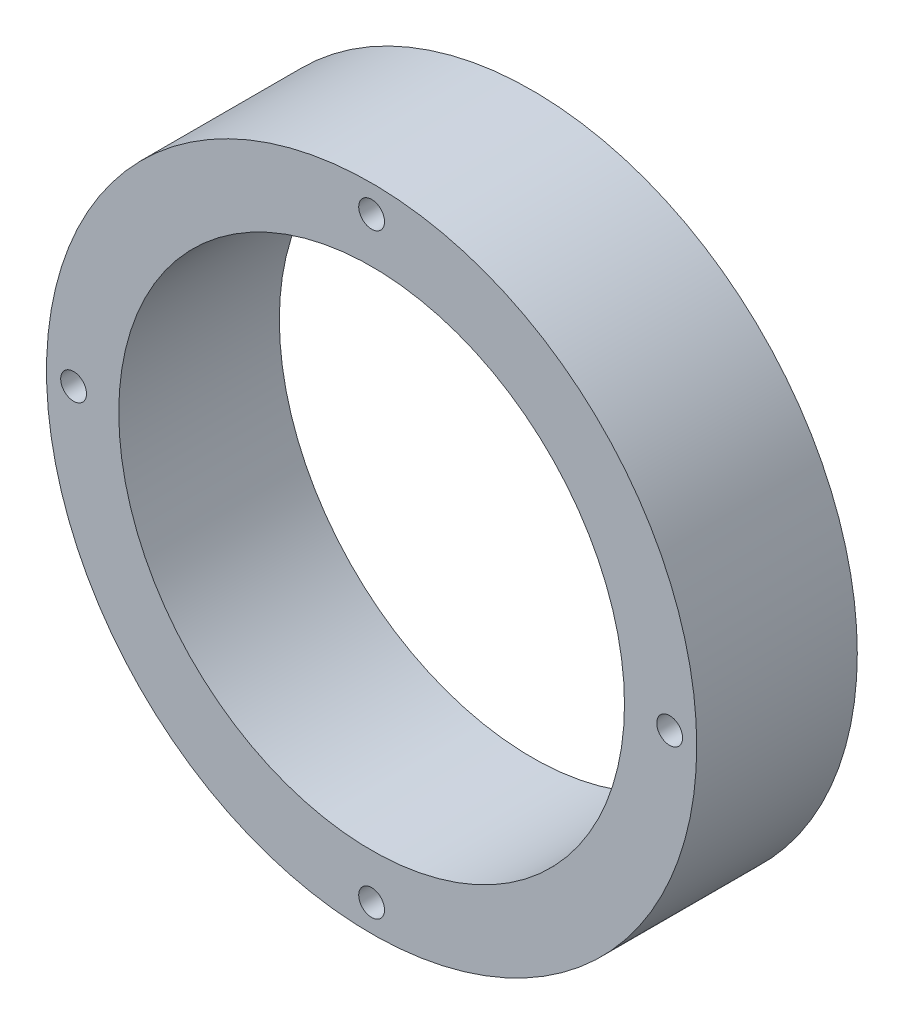
ISO-10303-21;
HEADER;
FILE_DESCRIPTION(('STEP AP214'),'2;1');
FILE_NAME('part.step','',(''),(''),'','','');
FILE_SCHEMA(('AUTOMOTIVE_DESIGN { 1 0 10303 214 1 1 1 1 }'));
ENDSEC;
DATA;
#1=APPLICATION_CONTEXT('core data for automotive mechanical design processes');
#2=APPLICATION_PROTOCOL_DEFINITION('international standard','automotive_design',2000,#1);
#3=PRODUCT_CONTEXT('',#1,'mechanical');
#4=PRODUCT('Part','Part','',(#3));
#5=PRODUCT_RELATED_PRODUCT_CATEGORY('part','',(#4));
#6=PRODUCT_DEFINITION_FORMATION('','',#4);
#7=PRODUCT_DEFINITION_CONTEXT('part definition',#1,'design');
#8=PRODUCT_DEFINITION('design','',#6,#7);
#9=PRODUCT_DEFINITION_SHAPE('','',#8);
#10=(LENGTH_UNIT() NAMED_UNIT(*) SI_UNIT(.MILLI.,.METRE.));
#11=(NAMED_UNIT(*) PLANE_ANGLE_UNIT() SI_UNIT($,.RADIAN.));
#12=(NAMED_UNIT(*) SI_UNIT($,.STERADIAN.) SOLID_ANGLE_UNIT());
#13=UNCERTAINTY_MEASURE_WITH_UNIT(LENGTH_MEASURE(1.E-05),#10,'distance_accuracy_value','');
#14=(GEOMETRIC_REPRESENTATION_CONTEXT(3) GLOBAL_UNCERTAINTY_ASSIGNED_CONTEXT((#13)) GLOBAL_UNIT_ASSIGNED_CONTEXT((#10,
#11,#12)) REPRESENTATION_CONTEXT('',''));
#15=CARTESIAN_POINT('',(0.,0.,0.));
#16=DIRECTION('',(0.,0.,1.));
#17=DIRECTION('',(1.,0.,0.));
#18=AXIS2_PLACEMENT_3D('',#15,#16,#17);
#19=CARTESIAN_POINT('',(0.,0.,22.225));
#20=DIRECTION('',(0.,0.,1.));
#21=DIRECTION('',(1.,0.,0.));
#22=AXIS2_PLACEMENT_3D('',#19,#20,#21);
#23=PLANE('',#22);
#24=CARTESIAN_POINT('',(0.,-41.25,22.225));
#25=DIRECTION('',(0.,0.,1.));
#26=DIRECTION('',(1.,0.,0.));
#27=AXIS2_PLACEMENT_3D('',#24,#25,#26);
#28=CIRCLE('',#27,1.7859375);
#29=CARTESIAN_POINT('',(1.7859375,-41.25,22.225));
#30=VERTEX_POINT('',#29);
#31=EDGE_CURVE('E72',#30,#30,#28,.T.);
#32=ORIENTED_EDGE('',*,*,#31,.F.);
#33=EDGE_LOOP('',(#32));
#34=FACE_BOUND('',#33,.T.);
#35=CARTESIAN_POINT('',(0.,41.25,22.225));
#36=DIRECTION('',(0.,0.,1.));
#37=DIRECTION('',(1.,0.,0.));
#38=AXIS2_PLACEMENT_3D('',#35,#36,#37);
#39=CIRCLE('',#38,1.7859375);
#40=CARTESIAN_POINT('',(1.7859375,41.25,22.225));
#41=VERTEX_POINT('',#40);
#42=EDGE_CURVE('E56',#41,#41,#39,.T.);
#43=ORIENTED_EDGE('',*,*,#42,.F.);
#44=EDGE_LOOP('',(#43));
#45=FACE_BOUND('',#44,.T.);
#46=CARTESIAN_POINT('',(0.,0.,22.225));
#47=DIRECTION('',(0.,0.,1.));
#48=DIRECTION('',(1.,0.,0.));
#49=AXIS2_PLACEMENT_3D('',#46,#47,#48);
#50=CIRCLE('',#49,45.);
#51=CARTESIAN_POINT('',(45.,0.,22.225));
#52=VERTEX_POINT('',#51);
#53=EDGE_CURVE('E10',#52,#52,#50,.T.);
#54=ORIENTED_EDGE('',*,*,#53,.T.);
#55=EDGE_LOOP('',(#54));
#56=FACE_BOUND('',#55,.T.);
#57=CARTESIAN_POINT('',(0.,0.,22.225));
#58=DIRECTION('',(0.,0.,1.));
#59=DIRECTION('',(1.,0.,0.));
#60=AXIS2_PLACEMENT_3D('',#57,#58,#59);
#61=CIRCLE('',#60,35.);
#62=CARTESIAN_POINT('',(35.,0.,22.225));
#63=VERTEX_POINT('',#62);
#64=EDGE_CURVE('E50',#63,#63,#61,.T.);
#65=ORIENTED_EDGE('',*,*,#64,.F.);
#66=EDGE_LOOP('',(#65));
#67=FACE_BOUND('',#66,.T.);
#68=CARTESIAN_POINT('',(41.25,0.,22.225));
#69=DIRECTION('',(0.,0.,1.));
#70=DIRECTION('',(1.,0.,0.));
#71=AXIS2_PLACEMENT_3D('',#68,#69,#70);
#72=CIRCLE('',#71,1.7859375);
#73=CARTESIAN_POINT('',(43.0359375,0.,22.225));
#74=VERTEX_POINT('',#73);
#75=EDGE_CURVE('E64',#74,#74,#72,.T.);
#76=ORIENTED_EDGE('',*,*,#75,.F.);
#77=EDGE_LOOP('',(#76));
#78=FACE_BOUND('',#77,.T.);
#79=CARTESIAN_POINT('',(-41.25,0.,22.225));
#80=DIRECTION('',(0.,0.,1.));
#81=DIRECTION('',(1.,0.,0.));
#82=AXIS2_PLACEMENT_3D('',#79,#80,#81);
#83=CIRCLE('',#82,1.7859375);
#84=CARTESIAN_POINT('',(-39.4640625,0.,22.225));
#85=VERTEX_POINT('',#84);
#86=EDGE_CURVE('E80',#85,#85,#83,.T.);
#87=ORIENTED_EDGE('',*,*,#86,.F.);
#88=EDGE_LOOP('',(#87));
#89=FACE_BOUND('',#88,.T.);
#90=ADVANCED_FACE('F37',(#34,#45,#56,#67,#78,#89),#23,.T.);
#91=CARTESIAN_POINT('',(0.,0.,0.));
#92=DIRECTION('',(0.,0.,1.));
#93=DIRECTION('',(1.,0.,0.));
#94=AXIS2_PLACEMENT_3D('',#91,#92,#93);
#95=PLANE('',#94);
#96=CARTESIAN_POINT('',(0.,0.,0.));
#97=DIRECTION('',(0.,0.,1.));
#98=DIRECTION('',(1.,0.,0.));
#99=AXIS2_PLACEMENT_3D('',#96,#97,#98);
#100=CIRCLE('',#99,45.);
#101=CARTESIAN_POINT('',(45.,0.,0.));
#102=VERTEX_POINT('',#101);
#103=EDGE_CURVE('E41',#102,#102,#100,.T.);
#104=ORIENTED_EDGE('',*,*,#103,.F.);
#105=EDGE_LOOP('',(#104));
#106=FACE_BOUND('',#105,.T.);
#107=CARTESIAN_POINT('',(0.,0.,0.));
#108=DIRECTION('',(0.,0.,1.));
#109=DIRECTION('',(1.,0.,0.));
#110=AXIS2_PLACEMENT_3D('',#107,#108,#109);
#111=CIRCLE('',#110,35.);
#112=CARTESIAN_POINT('',(35.,0.,0.));
#113=VERTEX_POINT('',#112);
#114=EDGE_CURVE('E52',#113,#113,#111,.T.);
#115=ORIENTED_EDGE('',*,*,#114,.T.);
#116=EDGE_LOOP('',(#115));
#117=FACE_BOUND('',#116,.T.);
#118=CARTESIAN_POINT('',(0.,41.25,0.));
#119=DIRECTION('',(0.,0.,1.));
#120=DIRECTION('',(1.,0.,0.));
#121=AXIS2_PLACEMENT_3D('',#118,#119,#120);
#122=CIRCLE('',#121,1.7859375);
#123=CARTESIAN_POINT('',(1.7859375,41.25,0.));
#124=VERTEX_POINT('',#123);
#125=EDGE_CURVE('E60',#124,#124,#122,.T.);
#126=ORIENTED_EDGE('',*,*,#125,.T.);
#127=EDGE_LOOP('',(#126));
#128=FACE_BOUND('',#127,.T.);
#129=CARTESIAN_POINT('',(41.25,0.,0.));
#130=DIRECTION('',(0.,0.,1.));
#131=DIRECTION('',(1.,0.,0.));
#132=AXIS2_PLACEMENT_3D('',#129,#130,#131);
#133=CIRCLE('',#132,1.7859375);
#134=CARTESIAN_POINT('',(43.0359375,0.,0.));
#135=VERTEX_POINT('',#134);
#136=EDGE_CURVE('E68',#135,#135,#133,.T.);
#137=ORIENTED_EDGE('',*,*,#136,.T.);
#138=EDGE_LOOP('',(#137));
#139=FACE_BOUND('',#138,.T.);
#140=CARTESIAN_POINT('',(0.,-41.25,0.));
#141=DIRECTION('',(0.,0.,1.));
#142=DIRECTION('',(1.,0.,0.));
#143=AXIS2_PLACEMENT_3D('',#140,#141,#142);
#144=CIRCLE('',#143,1.7859375);
#145=CARTESIAN_POINT('',(1.7859375,-41.25,0.));
#146=VERTEX_POINT('',#145);
#147=EDGE_CURVE('E76',#146,#146,#144,.T.);
#148=ORIENTED_EDGE('',*,*,#147,.T.);
#149=EDGE_LOOP('',(#148));
#150=FACE_BOUND('',#149,.T.);
#151=CARTESIAN_POINT('',(-41.25,0.,0.));
#152=DIRECTION('',(0.,0.,1.));
#153=DIRECTION('',(1.,0.,0.));
#154=AXIS2_PLACEMENT_3D('',#151,#152,#153);
#155=CIRCLE('',#154,1.7859375);
#156=CARTESIAN_POINT('',(-39.4640625,0.,0.));
#157=VERTEX_POINT('',#156);
#158=EDGE_CURVE('E84',#157,#157,#155,.T.);
#159=ORIENTED_EDGE('',*,*,#158,.T.);
#160=EDGE_LOOP('',(#159));
#161=FACE_BOUND('',#160,.T.);
#162=ADVANCED_FACE('F96',(#106,#117,#128,#139,#150,#161),#95,.F.);
#163=CARTESIAN_POINT('',(0.,0.,22.225));
#164=DIRECTION('',(0.,0.,-1.));
#165=DIRECTION('',(-1.,0.,0.));
#166=AXIS2_PLACEMENT_3D('',#163,#164,#165);
#167=CYLINDRICAL_SURFACE('',#166,45.);
#168=ORIENTED_EDGE('',*,*,#53,.F.);
#169=EDGE_LOOP('',(#168));
#170=FACE_BOUND('',#169,.T.);
#171=ORIENTED_EDGE('',*,*,#103,.T.);
#172=EDGE_LOOP('',(#171));
#173=FACE_BOUND('',#172,.T.);
#174=ADVANCED_FACE('F39',(#170,#173),#167,.T.);
#175=CARTESIAN_POINT('',(0.,0.,22.225));
#176=DIRECTION('',(0.,0.,-1.));
#177=DIRECTION('',(-1.,0.,0.));
#178=AXIS2_PLACEMENT_3D('',#175,#176,#177);
#179=CYLINDRICAL_SURFACE('',#178,35.);
#180=ORIENTED_EDGE('',*,*,#64,.T.);
#181=EDGE_LOOP('',(#180));
#182=FACE_BOUND('',#181,.T.);
#183=ORIENTED_EDGE('',*,*,#114,.F.);
#184=EDGE_LOOP('',(#183));
#185=FACE_BOUND('',#184,.T.);
#186=ADVANCED_FACE('F106',(#182,#185),#179,.F.);
#187=CARTESIAN_POINT('',(0.,41.25,22.225));
#188=DIRECTION('',(0.,0.,-1.));
#189=DIRECTION('',(-1.,0.,0.));
#190=AXIS2_PLACEMENT_3D('',#187,#188,#189);
#191=CYLINDRICAL_SURFACE('',#190,1.7859375);
#192=ORIENTED_EDGE('',*,*,#42,.T.);
#193=EDGE_LOOP('',(#192));
#194=FACE_BOUND('',#193,.T.);
#195=ORIENTED_EDGE('',*,*,#125,.F.);
#196=EDGE_LOOP('',(#195));
#197=FACE_BOUND('',#196,.T.);
#198=ADVANCED_FACE('F109',(#194,#197),#191,.F.);
#199=CARTESIAN_POINT('',(41.25,0.,22.225));
#200=DIRECTION('',(0.,0.,-1.));
#201=DIRECTION('',(-1.,0.,0.));
#202=AXIS2_PLACEMENT_3D('',#199,#200,#201);
#203=CYLINDRICAL_SURFACE('',#202,1.7859375);
#204=ORIENTED_EDGE('',*,*,#75,.T.);
#205=EDGE_LOOP('',(#204));
#206=FACE_BOUND('',#205,.T.);
#207=ORIENTED_EDGE('',*,*,#136,.F.);
#208=EDGE_LOOP('',(#207));
#209=FACE_BOUND('',#208,.T.);
#210=ADVANCED_FACE('F113',(#206,#209),#203,.F.);
#211=CARTESIAN_POINT('',(0.,-41.25,22.225));
#212=DIRECTION('',(0.,0.,-1.));
#213=DIRECTION('',(-1.,0.,0.));
#214=AXIS2_PLACEMENT_3D('',#211,#212,#213);
#215=CYLINDRICAL_SURFACE('',#214,1.7859375);
#216=ORIENTED_EDGE('',*,*,#31,.T.);
#217=EDGE_LOOP('',(#216));
#218=FACE_BOUND('',#217,.T.);
#219=ORIENTED_EDGE('',*,*,#147,.F.);
#220=EDGE_LOOP('',(#219));
#221=FACE_BOUND('',#220,.T.);
#222=ADVANCED_FACE('F117',(#218,#221),#215,.F.);
#223=CARTESIAN_POINT('',(-41.25,0.,22.225));
#224=DIRECTION('',(0.,0.,-1.));
#225=DIRECTION('',(-1.,0.,0.));
#226=AXIS2_PLACEMENT_3D('',#223,#224,#225);
#227=CYLINDRICAL_SURFACE('',#226,1.7859375);
#228=ORIENTED_EDGE('',*,*,#86,.T.);
#229=EDGE_LOOP('',(#228));
#230=FACE_BOUND('',#229,.T.);
#231=ORIENTED_EDGE('',*,*,#158,.F.);
#232=EDGE_LOOP('',(#231));
#233=FACE_BOUND('',#232,.T.);
#234=ADVANCED_FACE('F92',(#230,#233),#227,.F.);
#235=CLOSED_SHELL('',(#90,#162,#174,#186,#198,#210,#222,#234));
#236=MANIFOLD_SOLID_BREP('B2',#235);
#237=ADVANCED_BREP_SHAPE_REPRESENTATION('',(#18,#236),#14);
#238=SHAPE_DEFINITION_REPRESENTATION(#9,#237);
ENDSEC;
END-ISO-10303-21;
